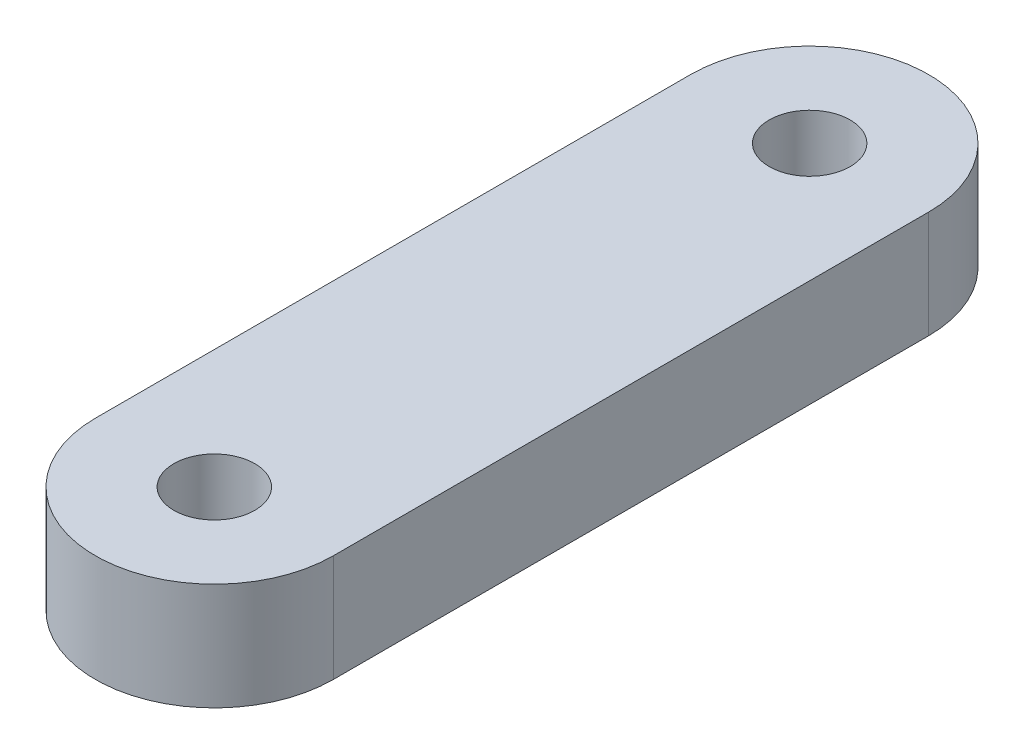
ISO-10303-21;
HEADER;
FILE_DESCRIPTION(('STEP AP214'),'2;1');
FILE_NAME('part.step','',(''),(''),'','','');
FILE_SCHEMA(('AUTOMOTIVE_DESIGN { 1 0 10303 214 1 1 1 1 }'));
ENDSEC;
DATA;
#1=APPLICATION_CONTEXT('core data for automotive mechanical design processes');
#2=APPLICATION_PROTOCOL_DEFINITION('international standard','automotive_design',2000,#1);
#3=PRODUCT_CONTEXT('',#1,'mechanical');
#4=PRODUCT('Part','Part','',(#3));
#5=PRODUCT_RELATED_PRODUCT_CATEGORY('part','',(#4));
#6=PRODUCT_DEFINITION_FORMATION('','',#4);
#7=PRODUCT_DEFINITION_CONTEXT('part definition',#1,'design');
#8=PRODUCT_DEFINITION('design','',#6,#7);
#9=PRODUCT_DEFINITION_SHAPE('','',#8);
#10=(LENGTH_UNIT() NAMED_UNIT(*) SI_UNIT(.MILLI.,.METRE.));
#11=(NAMED_UNIT(*) PLANE_ANGLE_UNIT() SI_UNIT($,.RADIAN.));
#12=(NAMED_UNIT(*) SI_UNIT($,.STERADIAN.) SOLID_ANGLE_UNIT());
#13=UNCERTAINTY_MEASURE_WITH_UNIT(LENGTH_MEASURE(1.E-05),#10,'distance_accuracy_value','');
#14=(GEOMETRIC_REPRESENTATION_CONTEXT(3) GLOBAL_UNCERTAINTY_ASSIGNED_CONTEXT((#13)) GLOBAL_UNIT_ASSIGNED_CONTEXT((#10,
#11,#12)) REPRESENTATION_CONTEXT('',''));
#15=CARTESIAN_POINT('',(0.,0.,0.));
#16=DIRECTION('',(0.,0.,1.));
#17=DIRECTION('',(1.,0.,0.));
#18=AXIS2_PLACEMENT_3D('',#15,#16,#17);
#19=CARTESIAN_POINT('',(0.,4.5,0.));
#20=DIRECTION('',(0.,1.,0.));
#21=DIRECTION('',(0.,0.,1.));
#22=AXIS2_PLACEMENT_3D('',#19,#20,#21);
#23=PLANE('',#22);
#24=CARTESIAN_POINT('',(0.,4.5,0.));
#25=DIRECTION('',(0.,1.,0.));
#26=DIRECTION('',(0.,0.,1.));
#27=AXIS2_PLACEMENT_3D('',#24,#25,#26);
#28=CIRCLE('',#27,1.7);
#29=CARTESIAN_POINT('',(0.,4.5,1.7));
#30=VERTEX_POINT('',#29);
#31=EDGE_CURVE('E105',#30,#30,#28,.T.);
#32=ORIENTED_EDGE('',*,*,#31,.F.);
#33=EDGE_LOOP('',(#32));
#34=FACE_BOUND('',#33,.T.);
#35=CARTESIAN_POINT('',(0.,4.5,0.));
#36=DIRECTION('',(0.,1.,0.));
#37=DIRECTION('',(0.,0.,1.));
#38=AXIS2_PLACEMENT_3D('',#35,#36,#37);
#39=CIRCLE('',#38,5.);
#40=CARTESIAN_POINT('',(-5.,4.5,0.));
#41=VERTEX_POINT('',#40);
#42=CARTESIAN_POINT('',(5.,4.5,0.));
#43=VERTEX_POINT('',#42);
#44=EDGE_CURVE('E90',#41,#43,#39,.T.);
#45=ORIENTED_EDGE('',*,*,#44,.T.);
#46=DIRECTION('',(0.,0.,-1.));
#47=VECTOR('',#46,1.);
#48=CARTESIAN_POINT('',(5.,4.5,0.));
#49=LINE('',#48,#47);
#50=CARTESIAN_POINT('',(5.,4.5,-25.));
#51=VERTEX_POINT('',#50);
#52=EDGE_CURVE('E85',#43,#51,#49,.T.);
#53=ORIENTED_EDGE('',*,*,#52,.T.);
#54=CARTESIAN_POINT('',(0.,4.5,-25.));
#55=DIRECTION('',(0.,1.,0.));
#56=DIRECTION('',(0.,0.,1.));
#57=AXIS2_PLACEMENT_3D('',#54,#55,#56);
#58=CIRCLE('',#57,5.);
#59=CARTESIAN_POINT('',(-5.,4.5,-25.));
#60=VERTEX_POINT('',#59);
#61=EDGE_CURVE('E88',#51,#60,#58,.T.);
#62=ORIENTED_EDGE('',*,*,#61,.T.);
#63=DIRECTION('',(0.,0.,1.));
#64=VECTOR('',#63,1.);
#65=CARTESIAN_POINT('',(-5.,4.5,0.));
#66=LINE('',#65,#64);
#67=EDGE_CURVE('E55',#60,#41,#66,.T.);
#68=ORIENTED_EDGE('',*,*,#67,.T.);
#69=EDGE_LOOP('',(#45,#53,#62,#68));
#70=FACE_BOUND('',#69,.T.);
#71=CARTESIAN_POINT('',(0.,4.5,-25.));
#72=DIRECTION('',(0.,1.,0.));
#73=DIRECTION('',(0.,0.,1.));
#74=AXIS2_PLACEMENT_3D('',#71,#72,#73);
#75=CIRCLE('',#74,1.7);
#76=CARTESIAN_POINT('',(0.,4.5,-23.3));
#77=VERTEX_POINT('',#76);
#78=EDGE_CURVE('E120',#77,#77,#75,.T.);
#79=ORIENTED_EDGE('',*,*,#78,.F.);
#80=EDGE_LOOP('',(#79));
#81=FACE_BOUND('',#80,.T.);
#82=ADVANCED_FACE('F38',(#34,#70,#81),#23,.T.);
#83=CARTESIAN_POINT('',(0.,0.,0.));
#84=DIRECTION('',(0.,1.,0.));
#85=DIRECTION('',(0.,0.,1.));
#86=AXIS2_PLACEMENT_3D('',#83,#84,#85);
#87=PLANE('',#86);
#88=CARTESIAN_POINT('',(0.,0.,0.));
#89=DIRECTION('',(0.,1.,0.));
#90=DIRECTION('',(0.,0.,1.));
#91=AXIS2_PLACEMENT_3D('',#88,#89,#90);
#92=CIRCLE('',#91,5.);
#93=CARTESIAN_POINT('',(-5.,0.,0.));
#94=VERTEX_POINT('',#93);
#95=CARTESIAN_POINT('',(5.,0.,0.));
#96=VERTEX_POINT('',#95);
#97=EDGE_CURVE('E102',#94,#96,#92,.T.);
#98=ORIENTED_EDGE('',*,*,#97,.F.);
#99=DIRECTION('',(0.,0.,1.));
#100=VECTOR('',#99,1.);
#101=CARTESIAN_POINT('',(-5.,0.,0.));
#102=LINE('',#101,#100);
#103=CARTESIAN_POINT('',(-5.,0.,-25.));
#104=VERTEX_POINT('',#103);
#105=EDGE_CURVE('E78',#104,#94,#102,.T.);
#106=ORIENTED_EDGE('',*,*,#105,.F.);
#107=CARTESIAN_POINT('',(0.,0.,-25.));
#108=DIRECTION('',(0.,1.,0.));
#109=DIRECTION('',(0.,0.,1.));
#110=AXIS2_PLACEMENT_3D('',#107,#108,#109);
#111=CIRCLE('',#110,5.);
#112=CARTESIAN_POINT('',(5.,0.,-25.));
#113=VERTEX_POINT('',#112);
#114=EDGE_CURVE('E72',#113,#104,#111,.T.);
#115=ORIENTED_EDGE('',*,*,#114,.F.);
#116=DIRECTION('',(0.,0.,-1.));
#117=VECTOR('',#116,1.);
#118=CARTESIAN_POINT('',(5.,0.,0.));
#119=LINE('',#118,#117);
#120=EDGE_CURVE('E94',#96,#113,#119,.T.);
#121=ORIENTED_EDGE('',*,*,#120,.F.);
#122=EDGE_LOOP('',(#98,#106,#115,#121));
#123=FACE_BOUND('',#122,.T.);
#124=CARTESIAN_POINT('',(0.,0.,0.));
#125=DIRECTION('',(0.,1.,0.));
#126=DIRECTION('',(0.,0.,1.));
#127=AXIS2_PLACEMENT_3D('',#124,#125,#126);
#128=CIRCLE('',#127,1.7);
#129=CARTESIAN_POINT('',(0.,0.,1.7));
#130=VERTEX_POINT('',#129);
#131=EDGE_CURVE('E117',#130,#130,#128,.T.);
#132=ORIENTED_EDGE('',*,*,#131,.T.);
#133=EDGE_LOOP('',(#132));
#134=FACE_BOUND('',#133,.T.);
#135=CARTESIAN_POINT('',(0.,0.,-25.));
#136=DIRECTION('',(0.,1.,0.));
#137=DIRECTION('',(0.,0.,1.));
#138=AXIS2_PLACEMENT_3D('',#135,#136,#137);
#139=CIRCLE('',#138,1.7);
#140=CARTESIAN_POINT('',(0.,0.,-23.3));
#141=VERTEX_POINT('',#140);
#142=EDGE_CURVE('E123',#141,#141,#139,.T.);
#143=ORIENTED_EDGE('',*,*,#142,.T.);
#144=EDGE_LOOP('',(#143));
#145=FACE_BOUND('',#144,.T.);
#146=ADVANCED_FACE('F113',(#123,#134,#145),#87,.F.);
#147=CARTESIAN_POINT('',(0.,4.5,0.));
#148=DIRECTION('',(0.,-1.,0.));
#149=DIRECTION('',(0.,0.,-1.));
#150=AXIS2_PLACEMENT_3D('',#147,#148,#149);
#151=CYLINDRICAL_SURFACE('',#150,5.);
#152=ORIENTED_EDGE('',*,*,#97,.T.);
#153=DIRECTION('',(0.,-1.,0.));
#154=VECTOR('',#153,1.);
#155=CARTESIAN_POINT('',(5.,4.5,0.));
#156=LINE('',#155,#154);
#157=EDGE_CURVE('E11',#43,#96,#156,.T.);
#158=ORIENTED_EDGE('',*,*,#157,.F.);
#159=ORIENTED_EDGE('',*,*,#44,.F.);
#160=DIRECTION('',(0.,-1.,0.));
#161=VECTOR('',#160,1.);
#162=CARTESIAN_POINT('',(-5.,4.5,0.));
#163=LINE('',#162,#161);
#164=EDGE_CURVE('E98',#41,#94,#163,.T.);
#165=ORIENTED_EDGE('',*,*,#164,.T.);
#166=EDGE_LOOP('',(#152,#158,#159,#165));
#167=FACE_BOUND('',#166,.T.);
#168=ADVANCED_FACE('F40',(#167),#151,.T.);
#169=CARTESIAN_POINT('',(5.,4.5,0.));
#170=DIRECTION('',(-1.,0.,0.));
#171=DIRECTION('',(0.,0.,1.));
#172=AXIS2_PLACEMENT_3D('',#169,#170,#171);
#173=PLANE('',#172);
#174=ORIENTED_EDGE('',*,*,#120,.T.);
#175=DIRECTION('',(0.,-1.,0.));
#176=VECTOR('',#175,1.);
#177=CARTESIAN_POINT('',(5.,4.5,-25.));
#178=LINE('',#177,#176);
#179=EDGE_CURVE('E47',#51,#113,#178,.T.);
#180=ORIENTED_EDGE('',*,*,#179,.F.);
#181=ORIENTED_EDGE('',*,*,#52,.F.);
#182=ORIENTED_EDGE('',*,*,#157,.T.);
#183=EDGE_LOOP('',(#174,#180,#181,#182));
#184=FACE_BOUND('',#183,.T.);
#185=ADVANCED_FACE('F93',(#184),#173,.F.);
#186=CARTESIAN_POINT('',(0.,4.5,-25.));
#187=DIRECTION('',(0.,-1.,0.));
#188=DIRECTION('',(0.,0.,-1.));
#189=AXIS2_PLACEMENT_3D('',#186,#187,#188);
#190=CYLINDRICAL_SURFACE('',#189,5.);
#191=ORIENTED_EDGE('',*,*,#114,.T.);
#192=DIRECTION('',(0.,-1.,0.));
#193=VECTOR('',#192,1.);
#194=CARTESIAN_POINT('',(-5.,4.5,-25.));
#195=LINE('',#194,#193);
#196=EDGE_CURVE('E95',#60,#104,#195,.T.);
#197=ORIENTED_EDGE('',*,*,#196,.F.);
#198=ORIENTED_EDGE('',*,*,#61,.F.);
#199=ORIENTED_EDGE('',*,*,#179,.T.);
#200=EDGE_LOOP('',(#191,#197,#198,#199));
#201=FACE_BOUND('',#200,.T.);
#202=ADVANCED_FACE('F96',(#201),#190,.T.);
#203=CARTESIAN_POINT('',(-5.,4.5,0.));
#204=DIRECTION('',(1.,0.,0.));
#205=DIRECTION('',(0.,0.,-1.));
#206=AXIS2_PLACEMENT_3D('',#203,#204,#205);
#207=PLANE('',#206);
#208=ORIENTED_EDGE('',*,*,#105,.T.);
#209=ORIENTED_EDGE('',*,*,#164,.F.);
#210=ORIENTED_EDGE('',*,*,#67,.F.);
#211=ORIENTED_EDGE('',*,*,#196,.T.);
#212=EDGE_LOOP('',(#208,#209,#210,#211));
#213=FACE_BOUND('',#212,.T.);
#214=ADVANCED_FACE('F110',(#213),#207,.F.);
#215=CARTESIAN_POINT('',(0.,4.5,0.));
#216=DIRECTION('',(0.,-1.,0.));
#217=DIRECTION('',(0.,0.,-1.));
#218=AXIS2_PLACEMENT_3D('',#215,#216,#217);
#219=CYLINDRICAL_SURFACE('',#218,1.7);
#220=ORIENTED_EDGE('',*,*,#31,.T.);
#221=EDGE_LOOP('',(#220));
#222=FACE_BOUND('',#221,.T.);
#223=ORIENTED_EDGE('',*,*,#131,.F.);
#224=EDGE_LOOP('',(#223));
#225=FACE_BOUND('',#224,.T.);
#226=ADVANCED_FACE('F140',(#222,#225),#219,.F.);
#227=CARTESIAN_POINT('',(0.,4.5,-25.));
#228=DIRECTION('',(0.,-1.,0.));
#229=DIRECTION('',(0.,0.,-1.));
#230=AXIS2_PLACEMENT_3D('',#227,#228,#229);
#231=CYLINDRICAL_SURFACE('',#230,1.7);
#232=ORIENTED_EDGE('',*,*,#78,.T.);
#233=EDGE_LOOP('',(#232));
#234=FACE_BOUND('',#233,.T.);
#235=ORIENTED_EDGE('',*,*,#142,.F.);
#236=EDGE_LOOP('',(#235));
#237=FACE_BOUND('',#236,.T.);
#238=ADVANCED_FACE('F129',(#234,#237),#231,.F.);
#239=CLOSED_SHELL('',(#82,#146,#168,#185,#202,#214,#226,#238));
#240=MANIFOLD_SOLID_BREP('B2',#239);
#241=ADVANCED_BREP_SHAPE_REPRESENTATION('',(#18,#240),#14);
#242=SHAPE_DEFINITION_REPRESENTATION(#9,#241);
ENDSEC;
END-ISO-10303-21;
